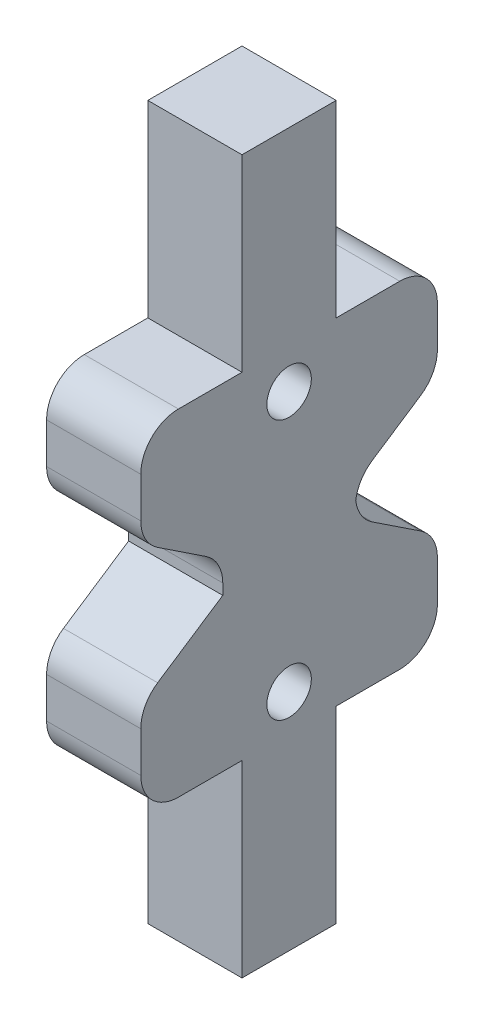
ISO-10303-21;
HEADER;
FILE_DESCRIPTION(('STEP AP214'),'2;1');
FILE_NAME('part.step','',(''),(''),'','','');
FILE_SCHEMA(('AUTOMOTIVE_DESIGN { 1 0 10303 214 1 1 1 1 }'));
ENDSEC;
DATA;
#1=APPLICATION_CONTEXT('core data for automotive mechanical design processes');
#2=APPLICATION_PROTOCOL_DEFINITION('international standard','automotive_design',2000,#1);
#3=PRODUCT_CONTEXT('',#1,'mechanical');
#4=PRODUCT('Part','Part','',(#3));
#5=PRODUCT_RELATED_PRODUCT_CATEGORY('part','',(#4));
#6=PRODUCT_DEFINITION_FORMATION('','',#4);
#7=PRODUCT_DEFINITION_CONTEXT('part definition',#1,'design');
#8=PRODUCT_DEFINITION('design','',#6,#7);
#9=PRODUCT_DEFINITION_SHAPE('','',#8);
#10=(LENGTH_UNIT() NAMED_UNIT(*) SI_UNIT(.MILLI.,.METRE.));
#11=(NAMED_UNIT(*) PLANE_ANGLE_UNIT() SI_UNIT($,.RADIAN.));
#12=(NAMED_UNIT(*) SI_UNIT($,.STERADIAN.) SOLID_ANGLE_UNIT());
#13=UNCERTAINTY_MEASURE_WITH_UNIT(LENGTH_MEASURE(1.E-05),#10,'distance_accuracy_value','');
#14=(GEOMETRIC_REPRESENTATION_CONTEXT(3) GLOBAL_UNCERTAINTY_ASSIGNED_CONTEXT((#13)) GLOBAL_UNIT_ASSIGNED_CONTEXT((#10,
#11,#12)) REPRESENTATION_CONTEXT('',''));
#15=CARTESIAN_POINT('',(0.,0.,0.));
#16=DIRECTION('',(0.,0.,1.));
#17=DIRECTION('',(1.,0.,0.));
#18=AXIS2_PLACEMENT_3D('',#15,#16,#17);
#19=CARTESIAN_POINT('',(6.35,0.,0.));
#20=DIRECTION('',(-1.,0.,0.));
#21=DIRECTION('',(0.,0.,1.));
#22=AXIS2_PLACEMENT_3D('',#19,#20,#21);
#23=PLANE('',#22);
#24=DIRECTION('',(0.,1.,0.));
#25=VECTOR('',#24,1.);
#26=CARTESIAN_POINT('',(6.35,16.0364207864945,-20.));
#27=LINE('',#26,#25);
#28=CARTESIAN_POINT('',(6.35,17.4012975552307,-20.));
#29=VERTEX_POINT('',#28);
#30=CARTESIAN_POINT('',(6.35,20.1259948,-20.));
#31=VERTEX_POINT('',#30);
#32=EDGE_CURVE('E291',#29,#31,#27,.T.);
#33=ORIENTED_EDGE('',*,*,#32,.T.);
#34=CARTESIAN_POINT('',(6.35,20.1259948,-17.46));
#35=DIRECTION('',(-1.,0.,0.));
#36=DIRECTION('',(0.,0.,1.));
#37=AXIS2_PLACEMENT_3D('',#34,#35,#36);
#38=CIRCLE('',#37,2.54);
#39=CARTESIAN_POINT('',(6.35,22.6659948,-17.46));
#40=VERTEX_POINT('',#39);
#41=EDGE_CURVE('E476',#31,#40,#38,.F.);
#42=ORIENTED_EDGE('',*,*,#41,.T.);
#43=DIRECTION('',(0.,0.,1.));
#44=VECTOR('',#43,1.);
#45=CARTESIAN_POINT('',(6.35,22.6659948,-13.175));
#46=LINE('',#45,#44);
#47=CARTESIAN_POINT('',(6.35,22.6659948,-13.175));
#48=VERTEX_POINT('',#47);
#49=EDGE_CURVE('E294',#40,#48,#46,.T.);
#50=ORIENTED_EDGE('',*,*,#49,.T.);
#51=DIRECTION('',(0.,1.,0.));
#52=VECTOR('',#51,1.);
#53=CARTESIAN_POINT('',(6.35,35.3659948,-13.175));
#54=LINE('',#53,#52);
#55=CARTESIAN_POINT('',(6.35,35.3659948,-13.175));
#56=VERTEX_POINT('',#55);
#57=EDGE_CURVE('E297',#48,#56,#54,.T.);
#58=ORIENTED_EDGE('',*,*,#57,.T.);
#59=DIRECTION('',(0.,0.,1.));
#60=VECTOR('',#59,1.);
#61=CARTESIAN_POINT('',(6.35,35.3659948,-6.825));
#62=LINE('',#61,#60);
#63=CARTESIAN_POINT('',(6.35,35.3659948,-6.825));
#64=VERTEX_POINT('',#63);
#65=EDGE_CURVE('E300',#56,#64,#62,.T.);
#66=ORIENTED_EDGE('',*,*,#65,.T.);
#67=DIRECTION('',(0.,-1.,0.));
#68=VECTOR('',#67,1.);
#69=CARTESIAN_POINT('',(6.35,35.3659948,-6.825));
#70=LINE('',#69,#68);
#71=CARTESIAN_POINT('',(6.35,22.6659948,-6.825));
#72=VERTEX_POINT('',#71);
#73=EDGE_CURVE('E303',#64,#72,#70,.T.);
#74=ORIENTED_EDGE('',*,*,#73,.T.);
#75=DIRECTION('',(0.,0.,1.));
#76=VECTOR('',#75,1.);
#77=CARTESIAN_POINT('',(6.35,22.6659948,0.));
#78=LINE('',#77,#76);
#79=CARTESIAN_POINT('',(6.35,22.6659948,-2.54));
#80=VERTEX_POINT('',#79);
#81=EDGE_CURVE('E306',#72,#80,#78,.T.);
#82=ORIENTED_EDGE('',*,*,#81,.T.);
#83=CARTESIAN_POINT('',(6.35,20.1259948,-2.54));
#84=DIRECTION('',(-1.,0.,0.));
#85=DIRECTION('',(0.,0.,1.));
#86=AXIS2_PLACEMENT_3D('',#83,#84,#85);
#87=CIRCLE('',#86,2.54);
#88=CARTESIAN_POINT('',(6.35,20.1259948,0.));
#89=VERTEX_POINT('',#88);
#90=EDGE_CURVE('E456',#80,#89,#87,.F.);
#91=ORIENTED_EDGE('',*,*,#90,.T.);
#92=DIRECTION('',(0.,-1.,0.));
#93=VECTOR('',#92,1.);
#94=CARTESIAN_POINT('',(6.35,16.0364207864945,0.));
#95=LINE('',#94,#93);
#96=CARTESIAN_POINT('',(6.35,17.4012975552307,0.));
#97=VERTEX_POINT('',#96);
#98=EDGE_CURVE('E310',#89,#97,#95,.T.);
#99=ORIENTED_EDGE('',*,*,#98,.T.);
#100=CARTESIAN_POINT('',(6.35,17.4012975552307,-2.54));
#101=DIRECTION('',(-1.,0.,0.));
#102=DIRECTION('',(0.,0.,1.));
#103=AXIS2_PLACEMENT_3D('',#100,#101,#102);
#104=CIRCLE('',#103,2.54);
#105=CARTESIAN_POINT('',(6.35,15.2831543016079,-1.13819075579723));
#106=VERTEX_POINT('',#105);
#107=EDGE_CURVE('E459',#97,#106,#104,.F.);
#108=ORIENTED_EDGE('',*,*,#107,.T.);
#109=DIRECTION('',(0.,-0.551893403229435,-0.83391466678062));
#110=VECTOR('',#109,1.);
#111=CARTESIAN_POINT('',(6.35,16.0364207864945,0.));
#112=LINE('',#111,#110);
#113=CARTESIAN_POINT('',(6.35,13.1308691071061,-4.39030824857267));
#114=VERTEX_POINT('',#113);
#115=EDGE_CURVE('E314',#106,#114,#112,.T.);
#116=ORIENTED_EDGE('',*,*,#115,.T.);
#117=CARTESIAN_POINT('',(6.35,11.0127258534833,-2.98849900436991));
#118=DIRECTION('',(-1.,0.,0.));
#119=DIRECTION('',(0.,0.,1.));
#120=AXIS2_PLACEMENT_3D('',#117,#118,#119);
#121=CIRCLE('',#120,2.54);
#122=CARTESIAN_POINT('',(6.35,11.0127258534833,-5.52849900436991));
#123=VERTEX_POINT('',#122);
#124=EDGE_CURVE('E11',#114,#123,#121,.T.);
#125=ORIENTED_EDGE('',*,*,#124,.T.);
#126=DIRECTION('',(0.,-1.,0.));
#127=VECTOR('',#126,1.);
#128=CARTESIAN_POINT('',(6.35,12.3776026222195,-5.5284990043699));
#129=LINE('',#128,#127);
#130=CARTESIAN_POINT('',(6.35,10.2883921777805,-5.52849900436991));
#131=VERTEX_POINT('',#130);
#132=EDGE_CURVE('E318',#123,#131,#129,.T.);
#133=ORIENTED_EDGE('',*,*,#132,.T.);
#134=DIRECTION('',(0.,-0.551893403229435,0.83391466678062));
#135=VECTOR('',#134,1.);
#136=CARTESIAN_POINT('',(6.35,10.2883921777805,-5.52849900436991));
#137=LINE('',#136,#135);
#138=CARTESIAN_POINT('',(6.35,7.38284049839211,-1.13819075579724));
#139=VERTEX_POINT('',#138);
#140=EDGE_CURVE('E321',#131,#139,#137,.T.);
#141=ORIENTED_EDGE('',*,*,#140,.T.);
#142=CARTESIAN_POINT('',(6.35,5.26469724476934,-2.54));
#143=DIRECTION('',(-1.,0.,0.));
#144=DIRECTION('',(0.,0.,1.));
#145=AXIS2_PLACEMENT_3D('',#142,#143,#144);
#146=CIRCLE('',#145,2.54);
#147=CARTESIAN_POINT('',(6.35,5.26469724476934,0.));
#148=VERTEX_POINT('',#147);
#149=EDGE_CURVE('E462',#139,#148,#146,.F.);
#150=ORIENTED_EDGE('',*,*,#149,.T.);
#151=DIRECTION('',(0.,-1.,0.));
#152=VECTOR('',#151,1.);
#153=CARTESIAN_POINT('',(6.35,0.,0.));
#154=LINE('',#153,#152);
#155=CARTESIAN_POINT('',(6.35,2.54,0.));
#156=VERTEX_POINT('',#155);
#157=EDGE_CURVE('E250',#148,#156,#154,.T.);
#158=ORIENTED_EDGE('',*,*,#157,.T.);
#159=CARTESIAN_POINT('',(6.35,2.54,-2.54));
#160=DIRECTION('',(-1.,0.,0.));
#161=DIRECTION('',(0.,0.,1.));
#162=AXIS2_PLACEMENT_3D('',#159,#160,#161);
#163=CIRCLE('',#162,2.54);
#164=CARTESIAN_POINT('',(6.35,0.,-2.54));
#165=VERTEX_POINT('',#164);
#166=EDGE_CURVE('E245',#156,#165,#163,.F.);
#167=ORIENTED_EDGE('',*,*,#166,.T.);
#168=DIRECTION('',(0.,0.,-1.));
#169=VECTOR('',#168,1.);
#170=CARTESIAN_POINT('',(6.35,0.,0.));
#171=LINE('',#170,#169);
#172=CARTESIAN_POINT('',(6.35,0.,-6.825));
#173=VERTEX_POINT('',#172);
#174=EDGE_CURVE('E236',#165,#173,#171,.T.);
#175=ORIENTED_EDGE('',*,*,#174,.T.);
#176=DIRECTION('',(0.,-1.,0.));
#177=VECTOR('',#176,1.);
#178=CARTESIAN_POINT('',(6.35,-12.7,-6.825));
#179=LINE('',#178,#177);
#180=CARTESIAN_POINT('',(6.35,-12.7,-6.825));
#181=VERTEX_POINT('',#180);
#182=EDGE_CURVE('E241',#173,#181,#179,.T.);
#183=ORIENTED_EDGE('',*,*,#182,.T.);
#184=DIRECTION('',(0.,0.,-1.));
#185=VECTOR('',#184,1.);
#186=CARTESIAN_POINT('',(6.35,-12.7,-6.825));
#187=LINE('',#186,#185);
#188=CARTESIAN_POINT('',(6.35,-12.7,-13.175));
#189=VERTEX_POINT('',#188);
#190=EDGE_CURVE('E267',#181,#189,#187,.T.);
#191=ORIENTED_EDGE('',*,*,#190,.T.);
#192=DIRECTION('',(0.,1.,0.));
#193=VECTOR('',#192,1.);
#194=CARTESIAN_POINT('',(6.35,-12.7,-13.175));
#195=LINE('',#194,#193);
#196=CARTESIAN_POINT('',(6.35,0.,-13.175));
#197=VERTEX_POINT('',#196);
#198=EDGE_CURVE('E270',#189,#197,#195,.T.);
#199=ORIENTED_EDGE('',*,*,#198,.T.);
#200=DIRECTION('',(0.,0.,-1.));
#201=VECTOR('',#200,1.);
#202=CARTESIAN_POINT('',(6.35,0.,-13.175));
#203=LINE('',#202,#201);
#204=CARTESIAN_POINT('',(6.35,0.,-17.46));
#205=VERTEX_POINT('',#204);
#206=EDGE_CURVE('E276',#197,#205,#203,.T.);
#207=ORIENTED_EDGE('',*,*,#206,.T.);
#208=CARTESIAN_POINT('',(6.35,2.54,-17.46));
#209=DIRECTION('',(-1.,0.,0.));
#210=DIRECTION('',(0.,0.,1.));
#211=AXIS2_PLACEMENT_3D('',#208,#209,#210);
#212=CIRCLE('',#211,2.54);
#213=CARTESIAN_POINT('',(6.35,2.54,-20.));
#214=VERTEX_POINT('',#213);
#215=EDGE_CURVE('E467',#205,#214,#212,.F.);
#216=ORIENTED_EDGE('',*,*,#215,.T.);
#217=DIRECTION('',(0.,1.,0.));
#218=VECTOR('',#217,1.);
#219=CARTESIAN_POINT('',(6.35,0.,-20.));
#220=LINE('',#219,#218);
#221=CARTESIAN_POINT('',(6.35,5.26469724476934,-20.));
#222=VERTEX_POINT('',#221);
#223=EDGE_CURVE('E280',#214,#222,#220,.T.);
#224=ORIENTED_EDGE('',*,*,#223,.T.);
#225=CARTESIAN_POINT('',(6.35,5.26469724476934,-17.46));
#226=DIRECTION('',(-1.,0.,0.));
#227=DIRECTION('',(0.,0.,1.));
#228=AXIS2_PLACEMENT_3D('',#225,#226,#227);
#229=CIRCLE('',#228,2.54);
#230=CARTESIAN_POINT('',(6.35,7.38284049839212,-18.8618092442028));
#231=VERTEX_POINT('',#230);
#232=EDGE_CURVE('E470',#222,#231,#229,.F.);
#233=ORIENTED_EDGE('',*,*,#232,.T.);
#234=DIRECTION('',(0.,0.551893403229435,0.83391466678062));
#235=VECTOR('',#234,1.);
#236=CARTESIAN_POINT('',(6.35,10.2883921777805,-14.4715009956301));
#237=LINE('',#236,#235);
#238=CARTESIAN_POINT('',(6.35,9.53512569289389,-15.6096917514273));
#239=VERTEX_POINT('',#238);
#240=EDGE_CURVE('E284',#231,#239,#237,.T.);
#241=ORIENTED_EDGE('',*,*,#240,.T.);
#242=CARTESIAN_POINT('',(6.35,11.6532689465167,-17.0115009956301));
#243=DIRECTION('',(-1.,0.,0.));
#244=DIRECTION('',(0.,0.,1.));
#245=AXIS2_PLACEMENT_3D('',#242,#243,#244);
#246=CIRCLE('',#245,2.54);
#247=CARTESIAN_POINT('',(6.35,11.3329974,-14.4917736023409));
#248=VERTEX_POINT('',#247);
#249=EDGE_CURVE('E56',#239,#248,#246,.T.);
#250=ORIENTED_EDGE('',*,*,#249,.T.);
#251=CARTESIAN_POINT('',(6.35,11.0127258534833,-17.0115009956301));
#252=DIRECTION('',(-1.,0.,0.));
#253=DIRECTION('',(0.,0.,1.));
#254=AXIS2_PLACEMENT_3D('',#251,#252,#253);
#255=CIRCLE('',#254,2.54);
#256=CARTESIAN_POINT('',(6.35,13.1308691071061,-15.6096917514273));
#257=VERTEX_POINT('',#256);
#258=EDGE_CURVE('E539',#248,#257,#255,.T.);
#259=ORIENTED_EDGE('',*,*,#258,.T.);
#260=DIRECTION('',(0.,0.551893403229435,-0.83391466678062));
#261=VECTOR('',#260,1.);
#262=CARTESIAN_POINT('',(6.35,16.0364207864945,-20.));
#263=LINE('',#262,#261);
#264=CARTESIAN_POINT('',(6.35,15.2831543016079,-18.8618092442028));
#265=VERTEX_POINT('',#264);
#266=EDGE_CURVE('E287',#257,#265,#263,.T.);
#267=ORIENTED_EDGE('',*,*,#266,.T.);
#268=CARTESIAN_POINT('',(6.35,17.4012975552307,-17.46));
#269=DIRECTION('',(-1.,0.,0.));
#270=DIRECTION('',(0.,0.,1.));
#271=AXIS2_PLACEMENT_3D('',#268,#269,#270);
#272=CIRCLE('',#271,2.54);
#273=EDGE_CURVE('E473',#265,#29,#272,.F.);
#274=ORIENTED_EDGE('',*,*,#273,.T.);
#275=EDGE_LOOP('',(#33,#42,#50,#58,#66,#74,#82,#91,#99,#108,#116,#125,#133,#141,#150,#158,#167,
#175,#183,#191,#199,#207,#216,#224,#233,#241,#250,#259,#267,#274));
#276=FACE_BOUND('',#275,.T.);
#277=CARTESIAN_POINT('',(6.35,19.9520048,-10.));
#278=DIRECTION('',(1.,0.,0.));
#279=DIRECTION('',(0.,0.,-1.));
#280=AXIS2_PLACEMENT_3D('',#277,#278,#279);
#281=CIRCLE('',#280,1.49987);
#282=CARTESIAN_POINT('',(6.35,19.9520048,-11.49987));
#283=VERTEX_POINT('',#282);
#284=EDGE_CURVE('E330',#283,#283,#281,.T.);
#285=ORIENTED_EDGE('',*,*,#284,.F.);
#286=EDGE_LOOP('',(#285));
#287=FACE_BOUND('',#286,.T.);
#288=CARTESIAN_POINT('',(6.35,2.4260048,-10.));
#289=DIRECTION('',(1.,0.,0.));
#290=DIRECTION('',(0.,0.,-1.));
#291=AXIS2_PLACEMENT_3D('',#288,#289,#290);
#292=CIRCLE('',#291,1.49987);
#293=CARTESIAN_POINT('',(6.35,2.4260048,-11.49987));
#294=VERTEX_POINT('',#293);
#295=EDGE_CURVE('E588',#294,#294,#292,.T.);
#296=ORIENTED_EDGE('',*,*,#295,.F.);
#297=EDGE_LOOP('',(#296));
#298=FACE_BOUND('',#297,.T.);
#299=ADVANCED_FACE('F39',(#276,#287,#298),#23,.F.);
#300=CARTESIAN_POINT('',(0.,0.,0.));
#301=DIRECTION('',(-1.,0.,0.));
#302=DIRECTION('',(0.,0.,1.));
#303=AXIS2_PLACEMENT_3D('',#300,#301,#302);
#304=PLANE('',#303);
#305=CARTESIAN_POINT('',(0.,19.9520048,-10.));
#306=DIRECTION('',(1.,0.,0.));
#307=DIRECTION('',(0.,0.,-1.));
#308=AXIS2_PLACEMENT_3D('',#305,#306,#307);
#309=CIRCLE('',#308,1.49987);
#310=CARTESIAN_POINT('',(0.,19.9520048,-11.49987));
#311=VERTEX_POINT('',#310);
#312=EDGE_CURVE('E584',#311,#311,#309,.T.);
#313=ORIENTED_EDGE('',*,*,#312,.T.);
#314=EDGE_LOOP('',(#313));
#315=FACE_BOUND('',#314,.T.);
#316=DIRECTION('',(0.,0.,1.));
#317=VECTOR('',#316,1.);
#318=CARTESIAN_POINT('',(0.,22.6659948,-13.175));
#319=LINE('',#318,#317);
#320=CARTESIAN_POINT('',(0.,22.6659948,-17.46));
#321=VERTEX_POINT('',#320);
#322=CARTESIAN_POINT('',(0.,22.6659948,-13.175));
#323=VERTEX_POINT('',#322);
#324=EDGE_CURVE('E362',#321,#323,#319,.T.);
#325=ORIENTED_EDGE('',*,*,#324,.F.);
#326=CARTESIAN_POINT('',(0.,20.1259948,-17.46));
#327=DIRECTION('',(-1.,0.,0.));
#328=DIRECTION('',(0.,0.,1.));
#329=AXIS2_PLACEMENT_3D('',#326,#327,#328);
#330=CIRCLE('',#329,2.54);
#331=CARTESIAN_POINT('',(0.,20.1259948,-20.));
#332=VERTEX_POINT('',#331);
#333=EDGE_CURVE('E446',#321,#332,#330,.T.);
#334=ORIENTED_EDGE('',*,*,#333,.T.);
#335=DIRECTION('',(0.,1.,0.));
#336=VECTOR('',#335,1.);
#337=CARTESIAN_POINT('',(0.,16.0364207864945,-20.));
#338=LINE('',#337,#336);
#339=CARTESIAN_POINT('',(0.,17.4012975552307,-20.));
#340=VERTEX_POINT('',#339);
#341=EDGE_CURVE('E358',#340,#332,#338,.T.);
#342=ORIENTED_EDGE('',*,*,#341,.F.);
#343=CARTESIAN_POINT('',(0.,17.4012975552307,-17.46));
#344=DIRECTION('',(-1.,0.,0.));
#345=DIRECTION('',(0.,0.,1.));
#346=AXIS2_PLACEMENT_3D('',#343,#344,#345);
#347=CIRCLE('',#346,2.54);
#348=CARTESIAN_POINT('',(0.,15.2831543016079,-18.8618092442028));
#349=VERTEX_POINT('',#348);
#350=EDGE_CURVE('E443',#340,#349,#347,.T.);
#351=ORIENTED_EDGE('',*,*,#350,.T.);
#352=DIRECTION('',(0.,0.551893403229435,-0.83391466678062));
#353=VECTOR('',#352,1.);
#354=CARTESIAN_POINT('',(0.,16.0364207864945,-20.));
#355=LINE('',#354,#353);
#356=CARTESIAN_POINT('',(0.,13.1308691071061,-15.6096917514273));
#357=VERTEX_POINT('',#356);
#358=EDGE_CURVE('E354',#357,#349,#355,.T.);
#359=ORIENTED_EDGE('',*,*,#358,.F.);
#360=CARTESIAN_POINT('',(0.,11.0127258534833,-17.0115009956301));
#361=DIRECTION('',(-1.,0.,0.));
#362=DIRECTION('',(0.,0.,1.));
#363=AXIS2_PLACEMENT_3D('',#360,#361,#362);
#364=CIRCLE('',#363,2.54);
#365=CARTESIAN_POINT('',(0.,11.3329974,-14.4917736023409));
#366=VERTEX_POINT('',#365);
#367=EDGE_CURVE('E64',#357,#366,#364,.F.);
#368=ORIENTED_EDGE('',*,*,#367,.T.);
#369=CARTESIAN_POINT('',(0.,11.6532689465167,-17.0115009956301));
#370=DIRECTION('',(-1.,0.,0.));
#371=DIRECTION('',(0.,0.,1.));
#372=AXIS2_PLACEMENT_3D('',#369,#370,#371);
#373=CIRCLE('',#372,2.54);
#374=CARTESIAN_POINT('',(0.,9.53512569289389,-15.6096917514273));
#375=VERTEX_POINT('',#374);
#376=EDGE_CURVE('E542',#366,#375,#373,.F.);
#377=ORIENTED_EDGE('',*,*,#376,.T.);
#378=DIRECTION('',(0.,0.551893403229435,0.83391466678062));
#379=VECTOR('',#378,1.);
#380=CARTESIAN_POINT('',(0.,10.2883921777805,-14.4715009956301));
#381=LINE('',#380,#379);
#382=CARTESIAN_POINT('',(0.,7.38284049839212,-18.8618092442028));
#383=VERTEX_POINT('',#382);
#384=EDGE_CURVE('E350',#383,#375,#381,.T.);
#385=ORIENTED_EDGE('',*,*,#384,.F.);
#386=CARTESIAN_POINT('',(0.,5.26469724476934,-17.46));
#387=DIRECTION('',(-1.,0.,0.));
#388=DIRECTION('',(0.,0.,1.));
#389=AXIS2_PLACEMENT_3D('',#386,#387,#388);
#390=CIRCLE('',#389,2.54);
#391=CARTESIAN_POINT('',(0.,5.26469724476934,-20.));
#392=VERTEX_POINT('',#391);
#393=EDGE_CURVE('E440',#383,#392,#390,.T.);
#394=ORIENTED_EDGE('',*,*,#393,.T.);
#395=DIRECTION('',(0.,1.,0.));
#396=VECTOR('',#395,1.);
#397=CARTESIAN_POINT('',(0.,0.,-20.));
#398=LINE('',#397,#396);
#399=CARTESIAN_POINT('',(0.,2.54,-20.));
#400=VERTEX_POINT('',#399);
#401=EDGE_CURVE('E346',#400,#392,#398,.T.);
#402=ORIENTED_EDGE('',*,*,#401,.F.);
#403=CARTESIAN_POINT('',(0.,2.54,-17.46));
#404=DIRECTION('',(-1.,0.,0.));
#405=DIRECTION('',(0.,0.,1.));
#406=AXIS2_PLACEMENT_3D('',#403,#404,#405);
#407=CIRCLE('',#406,2.54);
#408=CARTESIAN_POINT('',(0.,0.,-17.46));
#409=VERTEX_POINT('',#408);
#410=EDGE_CURVE('E437',#400,#409,#407,.T.);
#411=ORIENTED_EDGE('',*,*,#410,.T.);
#412=DIRECTION('',(0.,0.,-1.));
#413=VECTOR('',#412,1.);
#414=CARTESIAN_POINT('',(0.,0.,-13.175));
#415=LINE('',#414,#413);
#416=CARTESIAN_POINT('',(0.,0.,-13.175));
#417=VERTEX_POINT('',#416);
#418=EDGE_CURVE('E342',#417,#409,#415,.T.);
#419=ORIENTED_EDGE('',*,*,#418,.F.);
#420=DIRECTION('',(0.,1.,0.));
#421=VECTOR('',#420,1.);
#422=CARTESIAN_POINT('',(0.,-12.7,-13.175));
#423=LINE('',#422,#421);
#424=CARTESIAN_POINT('',(0.,-12.7,-13.175));
#425=VERTEX_POINT('',#424);
#426=EDGE_CURVE('E339',#425,#417,#423,.T.);
#427=ORIENTED_EDGE('',*,*,#426,.F.);
#428=DIRECTION('',(0.,0.,-1.));
#429=VECTOR('',#428,1.);
#430=CARTESIAN_POINT('',(0.,-12.7,-6.825));
#431=LINE('',#430,#429);
#432=CARTESIAN_POINT('',(0.,-12.7,-6.825));
#433=VERTEX_POINT('',#432);
#434=EDGE_CURVE('E336',#433,#425,#431,.T.);
#435=ORIENTED_EDGE('',*,*,#434,.F.);
#436=DIRECTION('',(0.,-1.,0.));
#437=VECTOR('',#436,1.);
#438=CARTESIAN_POINT('',(0.,-12.7,-6.825));
#439=LINE('',#438,#437);
#440=CARTESIAN_POINT('',(0.,0.,-6.825));
#441=VERTEX_POINT('',#440);
#442=EDGE_CURVE('E333',#441,#433,#439,.T.);
#443=ORIENTED_EDGE('',*,*,#442,.F.);
#444=DIRECTION('',(0.,0.,-1.));
#445=VECTOR('',#444,1.);
#446=CARTESIAN_POINT('',(0.,0.,0.));
#447=LINE('',#446,#445);
#448=CARTESIAN_POINT('',(0.,0.,-2.54));
#449=VERTEX_POINT('',#448);
#450=EDGE_CURVE('E256',#449,#441,#447,.T.);
#451=ORIENTED_EDGE('',*,*,#450,.F.);
#452=CARTESIAN_POINT('',(0.,2.54,-2.54));
#453=DIRECTION('',(-1.,0.,0.));
#454=DIRECTION('',(0.,0.,1.));
#455=AXIS2_PLACEMENT_3D('',#452,#453,#454);
#456=CIRCLE('',#455,2.54);
#457=CARTESIAN_POINT('',(0.,2.54,0.));
#458=VERTEX_POINT('',#457);
#459=EDGE_CURVE('E434',#449,#458,#456,.T.);
#460=ORIENTED_EDGE('',*,*,#459,.T.);
#461=DIRECTION('',(0.,-1.,0.));
#462=VECTOR('',#461,1.);
#463=CARTESIAN_POINT('',(0.,0.,0.));
#464=LINE('',#463,#462);
#465=CARTESIAN_POINT('',(0.,5.26469724476934,0.));
#466=VERTEX_POINT('',#465);
#467=EDGE_CURVE('E326',#466,#458,#464,.T.);
#468=ORIENTED_EDGE('',*,*,#467,.F.);
#469=CARTESIAN_POINT('',(0.,5.26469724476934,-2.54));
#470=DIRECTION('',(-1.,0.,0.));
#471=DIRECTION('',(0.,0.,1.));
#472=AXIS2_PLACEMENT_3D('',#469,#470,#471);
#473=CIRCLE('',#472,2.54);
#474=CARTESIAN_POINT('',(0.,7.38284049839211,-1.13819075579724));
#475=VERTEX_POINT('',#474);
#476=EDGE_CURVE('E431',#466,#475,#473,.T.);
#477=ORIENTED_EDGE('',*,*,#476,.T.);
#478=DIRECTION('',(0.,-0.551893403229435,0.83391466678062));
#479=VECTOR('',#478,1.);
#480=CARTESIAN_POINT('',(0.,10.2883921777805,-5.52849900436991));
#481=LINE('',#480,#479);
#482=CARTESIAN_POINT('',(0.,10.2883921777805,-5.52849900436991));
#483=VERTEX_POINT('',#482);
#484=EDGE_CURVE('E389',#483,#475,#481,.T.);
#485=ORIENTED_EDGE('',*,*,#484,.F.);
#486=DIRECTION('',(0.,-1.,0.));
#487=VECTOR('',#486,1.);
#488=CARTESIAN_POINT('',(0.,12.3776026222195,-5.5284990043699));
#489=LINE('',#488,#487);
#490=CARTESIAN_POINT('',(0.,11.0127258534833,-5.52849900436991));
#491=VERTEX_POINT('',#490);
#492=EDGE_CURVE('E386',#491,#483,#489,.T.);
#493=ORIENTED_EDGE('',*,*,#492,.F.);
#494=CARTESIAN_POINT('',(0.,11.0127258534833,-2.98849900436991));
#495=DIRECTION('',(-1.,0.,0.));
#496=DIRECTION('',(0.,0.,1.));
#497=AXIS2_PLACEMENT_3D('',#494,#495,#496);
#498=CIRCLE('',#497,2.54);
#499=CARTESIAN_POINT('',(0.,13.1308691071061,-4.39030824857267));
#500=VERTEX_POINT('',#499);
#501=EDGE_CURVE('E49',#491,#500,#498,.F.);
#502=ORIENTED_EDGE('',*,*,#501,.T.);
#503=DIRECTION('',(0.,-0.551893403229435,-0.83391466678062));
#504=VECTOR('',#503,1.);
#505=CARTESIAN_POINT('',(0.,16.0364207864945,0.));
#506=LINE('',#505,#504);
#507=CARTESIAN_POINT('',(0.,15.2831543016079,-1.13819075579723));
#508=VERTEX_POINT('',#507);
#509=EDGE_CURVE('E382',#508,#500,#506,.T.);
#510=ORIENTED_EDGE('',*,*,#509,.F.);
#511=CARTESIAN_POINT('',(0.,17.4012975552307,-2.54));
#512=DIRECTION('',(-1.,0.,0.));
#513=DIRECTION('',(0.,0.,1.));
#514=AXIS2_PLACEMENT_3D('',#511,#512,#513);
#515=CIRCLE('',#514,2.54);
#516=CARTESIAN_POINT('',(0.,17.4012975552307,0.));
#517=VERTEX_POINT('',#516);
#518=EDGE_CURVE('E428',#508,#517,#515,.T.);
#519=ORIENTED_EDGE('',*,*,#518,.T.);
#520=DIRECTION('',(0.,-1.,0.));
#521=VECTOR('',#520,1.);
#522=CARTESIAN_POINT('',(0.,16.0364207864945,0.));
#523=LINE('',#522,#521);
#524=CARTESIAN_POINT('',(0.,20.1259948,0.));
#525=VERTEX_POINT('',#524);
#526=EDGE_CURVE('E378',#525,#517,#523,.T.);
#527=ORIENTED_EDGE('',*,*,#526,.F.);
#528=CARTESIAN_POINT('',(0.,20.1259948,-2.54));
#529=DIRECTION('',(-1.,0.,0.));
#530=DIRECTION('',(0.,0.,1.));
#531=AXIS2_PLACEMENT_3D('',#528,#529,#530);
#532=CIRCLE('',#531,2.54);
#533=CARTESIAN_POINT('',(0.,22.6659948,-2.54));
#534=VERTEX_POINT('',#533);
#535=EDGE_CURVE('E425',#525,#534,#532,.T.);
#536=ORIENTED_EDGE('',*,*,#535,.T.);
#537=DIRECTION('',(0.,0.,1.));
#538=VECTOR('',#537,1.);
#539=CARTESIAN_POINT('',(0.,22.6659948,0.));
#540=LINE('',#539,#538);
#541=CARTESIAN_POINT('',(0.,22.6659948,-6.825));
#542=VERTEX_POINT('',#541);
#543=EDGE_CURVE('E374',#542,#534,#540,.T.);
#544=ORIENTED_EDGE('',*,*,#543,.F.);
#545=DIRECTION('',(0.,-1.,0.));
#546=VECTOR('',#545,1.);
#547=CARTESIAN_POINT('',(0.,35.3659948,-6.825));
#548=LINE('',#547,#546);
#549=CARTESIAN_POINT('',(0.,35.3659948,-6.825));
#550=VERTEX_POINT('',#549);
#551=EDGE_CURVE('E371',#550,#542,#548,.T.);
#552=ORIENTED_EDGE('',*,*,#551,.F.);
#553=DIRECTION('',(0.,0.,1.));
#554=VECTOR('',#553,1.);
#555=CARTESIAN_POINT('',(0.,35.3659948,-6.825));
#556=LINE('',#555,#554);
#557=CARTESIAN_POINT('',(0.,35.3659948,-13.175));
#558=VERTEX_POINT('',#557);
#559=EDGE_CURVE('E368',#558,#550,#556,.T.);
#560=ORIENTED_EDGE('',*,*,#559,.F.);
#561=DIRECTION('',(0.,1.,0.));
#562=VECTOR('',#561,1.);
#563=CARTESIAN_POINT('',(0.,35.3659948,-13.175));
#564=LINE('',#563,#562);
#565=EDGE_CURVE('E365',#323,#558,#564,.T.);
#566=ORIENTED_EDGE('',*,*,#565,.F.);
#567=EDGE_LOOP('',(#325,#334,#342,#351,#359,#368,#377,#385,#394,#402,#411,#419,#427,#435,#443,
#451,#460,#468,#477,#485,#493,#502,#510,#519,#527,#536,#544,#552,#560,#566));
#568=FACE_BOUND('',#567,.T.);
#569=CARTESIAN_POINT('',(0.,2.4260048,-10.));
#570=DIRECTION('',(1.,0.,0.));
#571=DIRECTION('',(0.,0.,-1.));
#572=AXIS2_PLACEMENT_3D('',#569,#570,#571);
#573=CIRCLE('',#572,1.49987);
#574=CARTESIAN_POINT('',(0.,2.4260048,-11.49987));
#575=VERTEX_POINT('',#574);
#576=EDGE_CURVE('E592',#575,#575,#573,.T.);
#577=ORIENTED_EDGE('',*,*,#576,.T.);
#578=EDGE_LOOP('',(#577));
#579=FACE_BOUND('',#578,.T.);
#580=ADVANCED_FACE('F551',(#315,#568,#579),#304,.T.);
#581=CARTESIAN_POINT('',(6.35,0.,0.));
#582=DIRECTION('',(0.,0.,-1.));
#583=DIRECTION('',(-1.,0.,0.));
#584=AXIS2_PLACEMENT_3D('',#581,#582,#583);
#585=PLANE('',#584);
#586=ORIENTED_EDGE('',*,*,#467,.T.);
#587=DIRECTION('',(-1.,0.,0.));
#588=VECTOR('',#587,1.);
#589=CARTESIAN_POINT('',(6.35,2.54,0.));
#590=LINE('',#589,#588);
#591=EDGE_CURVE('E510',#458,#156,#590,.F.);
#592=ORIENTED_EDGE('',*,*,#591,.T.);
#593=ORIENTED_EDGE('',*,*,#157,.F.);
#594=DIRECTION('',(-1.,0.,0.));
#595=VECTOR('',#594,1.);
#596=CARTESIAN_POINT('',(6.35,5.26469724476934,0.));
#597=LINE('',#596,#595);
#598=EDGE_CURVE('E506',#148,#466,#597,.T.);
#599=ORIENTED_EDGE('',*,*,#598,.T.);
#600=EDGE_LOOP('',(#586,#592,#593,#599));
#601=FACE_BOUND('',#600,.T.);
#602=ADVANCED_FACE('F578',(#601),#585,.F.);
#603=CARTESIAN_POINT('',(6.35,0.,0.));
#604=DIRECTION('',(0.,1.,0.));
#605=DIRECTION('',(0.,0.,1.));
#606=AXIS2_PLACEMENT_3D('',#603,#604,#605);
#607=PLANE('',#606);
#608=ORIENTED_EDGE('',*,*,#174,.F.);
#609=DIRECTION('',(-1.,0.,0.));
#610=VECTOR('',#609,1.);
#611=CARTESIAN_POINT('',(6.35,0.,-2.54));
#612=LINE('',#611,#610);
#613=EDGE_CURVE('E503',#165,#449,#612,.T.);
#614=ORIENTED_EDGE('',*,*,#613,.T.);
#615=ORIENTED_EDGE('',*,*,#450,.T.);
#616=DIRECTION('',(-1.,0.,0.));
#617=VECTOR('',#616,1.);
#618=CARTESIAN_POINT('',(6.35,0.,-6.825));
#619=LINE('',#618,#617);
#620=EDGE_CURVE('E253',#173,#441,#619,.T.);
#621=ORIENTED_EDGE('',*,*,#620,.F.);
#622=EDGE_LOOP('',(#608,#614,#615,#621));
#623=FACE_BOUND('',#622,.T.);
#624=ADVANCED_FACE('F254',(#623),#607,.F.);
#625=CARTESIAN_POINT('',(6.35,-12.7,-6.825));
#626=DIRECTION('',(0.,0.,-1.));
#627=DIRECTION('',(-1.,0.,0.));
#628=AXIS2_PLACEMENT_3D('',#625,#626,#627);
#629=PLANE('',#628);
#630=ORIENTED_EDGE('',*,*,#442,.T.);
#631=DIRECTION('',(-1.,0.,0.));
#632=VECTOR('',#631,1.);
#633=CARTESIAN_POINT('',(6.35,-12.7,-6.825));
#634=LINE('',#633,#632);
#635=EDGE_CURVE('E261',#181,#433,#634,.T.);
#636=ORIENTED_EDGE('',*,*,#635,.F.);
#637=ORIENTED_EDGE('',*,*,#182,.F.);
#638=ORIENTED_EDGE('',*,*,#620,.T.);
#639=EDGE_LOOP('',(#630,#636,#637,#638));
#640=FACE_BOUND('',#639,.T.);
#641=ADVANCED_FACE('F263',(#640),#629,.F.);
#642=CARTESIAN_POINT('',(6.35,-12.7,-6.825));
#643=DIRECTION('',(0.,1.,0.));
#644=DIRECTION('',(0.,0.,1.));
#645=AXIS2_PLACEMENT_3D('',#642,#643,#644);
#646=PLANE('',#645);
#647=ORIENTED_EDGE('',*,*,#434,.T.);
#648=DIRECTION('',(-1.,0.,0.));
#649=VECTOR('',#648,1.);
#650=CARTESIAN_POINT('',(6.35,-12.7,-13.175));
#651=LINE('',#650,#649);
#652=EDGE_CURVE('E416',#189,#425,#651,.T.);
#653=ORIENTED_EDGE('',*,*,#652,.F.);
#654=ORIENTED_EDGE('',*,*,#190,.F.);
#655=ORIENTED_EDGE('',*,*,#635,.T.);
#656=EDGE_LOOP('',(#647,#653,#654,#655));
#657=FACE_BOUND('',#656,.T.);
#658=ADVANCED_FACE('F667',(#657),#646,.F.);
#659=CARTESIAN_POINT('',(6.35,-12.7,-13.175));
#660=DIRECTION('',(0.,0.,1.));
#661=DIRECTION('',(1.,0.,0.));
#662=AXIS2_PLACEMENT_3D('',#659,#660,#661);
#663=PLANE('',#662);
#664=ORIENTED_EDGE('',*,*,#426,.T.);
#665=DIRECTION('',(-1.,0.,0.));
#666=VECTOR('',#665,1.);
#667=CARTESIAN_POINT('',(6.35,0.,-13.175));
#668=LINE('',#667,#666);
#669=EDGE_CURVE('E412',#197,#417,#668,.T.);
#670=ORIENTED_EDGE('',*,*,#669,.F.);
#671=ORIENTED_EDGE('',*,*,#198,.F.);
#672=ORIENTED_EDGE('',*,*,#652,.T.);
#673=EDGE_LOOP('',(#664,#670,#671,#672));
#674=FACE_BOUND('',#673,.T.);
#675=ADVANCED_FACE('F663',(#674),#663,.F.);
#676=CARTESIAN_POINT('',(6.35,0.,-13.175));
#677=DIRECTION('',(0.,1.,0.));
#678=DIRECTION('',(0.,0.,1.));
#679=AXIS2_PLACEMENT_3D('',#676,#677,#678);
#680=PLANE('',#679);
#681=ORIENTED_EDGE('',*,*,#418,.T.);
#682=DIRECTION('',(-1.,0.,0.));
#683=VECTOR('',#682,1.);
#684=CARTESIAN_POINT('',(6.35,0.,-17.46));
#685=LINE('',#684,#683);
#686=EDGE_CURVE('E500',#409,#205,#685,.F.);
#687=ORIENTED_EDGE('',*,*,#686,.T.);
#688=ORIENTED_EDGE('',*,*,#206,.F.);
#689=ORIENTED_EDGE('',*,*,#669,.T.);
#690=EDGE_LOOP('',(#681,#687,#688,#689));
#691=FACE_BOUND('',#690,.T.);
#692=ADVANCED_FACE('F659',(#691),#680,.F.);
#693=CARTESIAN_POINT('',(6.35,0.,-20.));
#694=DIRECTION('',(0.,0.,1.));
#695=DIRECTION('',(0.,-1.,0.));
#696=AXIS2_PLACEMENT_3D('',#693,#694,#695);
#697=PLANE('',#696);
#698=ORIENTED_EDGE('',*,*,#401,.T.);
#699=DIRECTION('',(-1.,0.,0.));
#700=VECTOR('',#699,1.);
#701=CARTESIAN_POINT('',(6.35,5.26469724476934,-20.));
#702=LINE('',#701,#700);
#703=EDGE_CURVE('E497',#392,#222,#702,.F.);
#704=ORIENTED_EDGE('',*,*,#703,.T.);
#705=ORIENTED_EDGE('',*,*,#223,.F.);
#706=DIRECTION('',(-1.,0.,0.));
#707=VECTOR('',#706,1.);
#708=CARTESIAN_POINT('',(6.35,2.54,-20.));
#709=LINE('',#708,#707);
#710=EDGE_CURVE('E493',#214,#400,#709,.T.);
#711=ORIENTED_EDGE('',*,*,#710,.T.);
#712=EDGE_LOOP('',(#698,#704,#705,#711));
#713=FACE_BOUND('',#712,.T.);
#714=ADVANCED_FACE('F655',(#713),#697,.F.);
#715=CARTESIAN_POINT('',(6.35,10.2883921777805,-14.4715009956301));
#716=DIRECTION('',(0.,-0.83391466678062,0.551893403229435));
#717=DIRECTION('',(0.,-0.551893403229435,-0.83391466678062));
#718=AXIS2_PLACEMENT_3D('',#715,#716,#717);
#719=PLANE('',#718);
#720=ORIENTED_EDGE('',*,*,#384,.T.);
#721=DIRECTION('',(-1.,0.,0.));
#722=VECTOR('',#721,1.);
#723=CARTESIAN_POINT('',(6.35,9.53512569289389,-15.6096917514273));
#724=LINE('',#723,#722);
#725=EDGE_CURVE('E490',#375,#239,#724,.F.);
#726=ORIENTED_EDGE('',*,*,#725,.T.);
#727=ORIENTED_EDGE('',*,*,#240,.F.);
#728=DIRECTION('',(-1.,0.,0.));
#729=VECTOR('',#728,1.);
#730=CARTESIAN_POINT('',(6.35,7.38284049839211,-18.8618092442028));
#731=LINE('',#730,#729);
#732=EDGE_CURVE('E486',#231,#383,#731,.T.);
#733=ORIENTED_EDGE('',*,*,#732,.T.);
#734=EDGE_LOOP('',(#720,#726,#727,#733));
#735=FACE_BOUND('',#734,.T.);
#736=ADVANCED_FACE('F651',(#735),#719,.F.);
#737=CARTESIAN_POINT('',(6.35,16.0364207864945,-20.));
#738=DIRECTION('',(0.,0.83391466678062,0.551893403229435));
#739=DIRECTION('',(0.,-0.551893403229435,0.83391466678062));
#740=AXIS2_PLACEMENT_3D('',#737,#738,#739);
#741=PLANE('',#740);
#742=ORIENTED_EDGE('',*,*,#266,.F.);
#743=DIRECTION('',(-1.,0.,0.));
#744=VECTOR('',#743,1.);
#745=CARTESIAN_POINT('',(0.,13.1308691071061,-15.6096917514273));
#746=LINE('',#745,#744);
#747=EDGE_CURVE('E482',#257,#357,#746,.T.);
#748=ORIENTED_EDGE('',*,*,#747,.T.);
#749=ORIENTED_EDGE('',*,*,#358,.T.);
#750=DIRECTION('',(-1.,0.,0.));
#751=VECTOR('',#750,1.);
#752=CARTESIAN_POINT('',(6.35,15.2831543016079,-18.8618092442028));
#753=LINE('',#752,#751);
#754=EDGE_CURVE('E479',#349,#265,#753,.F.);
#755=ORIENTED_EDGE('',*,*,#754,.T.);
#756=EDGE_LOOP('',(#742,#748,#749,#755));
#757=FACE_BOUND('',#756,.T.);
#758=ADVANCED_FACE('F647',(#757),#741,.F.);
#759=CARTESIAN_POINT('',(6.35,16.0364207864945,-20.));
#760=DIRECTION('',(0.,0.,1.));
#761=DIRECTION('',(1.,0.,0.));
#762=AXIS2_PLACEMENT_3D('',#759,#760,#761);
#763=PLANE('',#762);
#764=ORIENTED_EDGE('',*,*,#341,.T.);
#765=DIRECTION('',(-1.,0.,0.));
#766=VECTOR('',#765,1.);
#767=CARTESIAN_POINT('',(6.35,20.1259948,-20.));
#768=LINE('',#767,#766);
#769=EDGE_CURVE('E453',#332,#31,#768,.F.);
#770=ORIENTED_EDGE('',*,*,#769,.T.);
#771=ORIENTED_EDGE('',*,*,#32,.F.);
#772=DIRECTION('',(-1.,0.,0.));
#773=VECTOR('',#772,1.);
#774=CARTESIAN_POINT('',(6.35,17.4012975552307,-20.));
#775=LINE('',#774,#773);
#776=EDGE_CURVE('E449',#29,#340,#775,.T.);
#777=ORIENTED_EDGE('',*,*,#776,.T.);
#778=EDGE_LOOP('',(#764,#770,#771,#777));
#779=FACE_BOUND('',#778,.T.);
#780=ADVANCED_FACE('F643',(#779),#763,.F.);
#781=CARTESIAN_POINT('',(6.35,22.6659948,-13.175));
#782=DIRECTION('',(0.,-1.,0.));
#783=DIRECTION('',(0.,0.,-1.));
#784=AXIS2_PLACEMENT_3D('',#781,#782,#783);
#785=PLANE('',#784);
#786=ORIENTED_EDGE('',*,*,#49,.F.);
#787=DIRECTION('',(-1.,0.,0.));
#788=VECTOR('',#787,1.);
#789=CARTESIAN_POINT('',(6.35,22.6659948,-17.46));
#790=LINE('',#789,#788);
#791=EDGE_CURVE('E260',#40,#321,#790,.T.);
#792=ORIENTED_EDGE('',*,*,#791,.T.);
#793=ORIENTED_EDGE('',*,*,#324,.T.);
#794=DIRECTION('',(-1.,0.,0.));
#795=VECTOR('',#794,1.);
#796=CARTESIAN_POINT('',(6.35,22.6659948,-13.175));
#797=LINE('',#796,#795);
#798=EDGE_CURVE('E408',#48,#323,#797,.T.);
#799=ORIENTED_EDGE('',*,*,#798,.F.);
#800=EDGE_LOOP('',(#786,#792,#793,#799));
#801=FACE_BOUND('',#800,.T.);
#802=ADVANCED_FACE('F639',(#801),#785,.F.);
#803=CARTESIAN_POINT('',(6.35,35.3659948,-13.175));
#804=DIRECTION('',(0.,0.,1.));
#805=DIRECTION('',(1.,0.,0.));
#806=AXIS2_PLACEMENT_3D('',#803,#804,#805);
#807=PLANE('',#806);
#808=ORIENTED_EDGE('',*,*,#565,.T.);
#809=DIRECTION('',(-1.,0.,0.));
#810=VECTOR('',#809,1.);
#811=CARTESIAN_POINT('',(6.35,35.3659948,-13.175));
#812=LINE('',#811,#810);
#813=EDGE_CURVE('E404',#56,#558,#812,.T.);
#814=ORIENTED_EDGE('',*,*,#813,.F.);
#815=ORIENTED_EDGE('',*,*,#57,.F.);
#816=ORIENTED_EDGE('',*,*,#798,.T.);
#817=EDGE_LOOP('',(#808,#814,#815,#816));
#818=FACE_BOUND('',#817,.T.);
#819=ADVANCED_FACE('F635',(#818),#807,.F.);
#820=CARTESIAN_POINT('',(6.35,35.3659948,-6.825));
#821=DIRECTION('',(0.,-1.,0.));
#822=DIRECTION('',(0.,0.,-1.));
#823=AXIS2_PLACEMENT_3D('',#820,#821,#822);
#824=PLANE('',#823);
#825=ORIENTED_EDGE('',*,*,#559,.T.);
#826=DIRECTION('',(-1.,0.,0.));
#827=VECTOR('',#826,1.);
#828=CARTESIAN_POINT('',(6.35,35.3659948,-6.825));
#829=LINE('',#828,#827);
#830=EDGE_CURVE('E400',#64,#550,#829,.T.);
#831=ORIENTED_EDGE('',*,*,#830,.F.);
#832=ORIENTED_EDGE('',*,*,#65,.F.);
#833=ORIENTED_EDGE('',*,*,#813,.T.);
#834=EDGE_LOOP('',(#825,#831,#832,#833));
#835=FACE_BOUND('',#834,.T.);
#836=ADVANCED_FACE('F631',(#835),#824,.F.);
#837=CARTESIAN_POINT('',(6.35,35.3659948,-6.825));
#838=DIRECTION('',(0.,0.,-1.));
#839=DIRECTION('',(-1.,0.,0.));
#840=AXIS2_PLACEMENT_3D('',#837,#838,#839);
#841=PLANE('',#840);
#842=ORIENTED_EDGE('',*,*,#551,.T.);
#843=DIRECTION('',(-1.,0.,0.));
#844=VECTOR('',#843,1.);
#845=CARTESIAN_POINT('',(6.35,22.6659948,-6.825));
#846=LINE('',#845,#844);
#847=EDGE_CURVE('E396',#72,#542,#846,.T.);
#848=ORIENTED_EDGE('',*,*,#847,.F.);
#849=ORIENTED_EDGE('',*,*,#73,.F.);
#850=ORIENTED_EDGE('',*,*,#830,.T.);
#851=EDGE_LOOP('',(#842,#848,#849,#850));
#852=FACE_BOUND('',#851,.T.);
#853=ADVANCED_FACE('F627',(#852),#841,.F.);
#854=CARTESIAN_POINT('',(6.35,22.6659948,0.));
#855=DIRECTION('',(0.,-1.,0.));
#856=DIRECTION('',(0.,0.,-1.));
#857=AXIS2_PLACEMENT_3D('',#854,#855,#856);
#858=PLANE('',#857);
#859=ORIENTED_EDGE('',*,*,#543,.T.);
#860=DIRECTION('',(-1.,0.,0.));
#861=VECTOR('',#860,1.);
#862=CARTESIAN_POINT('',(6.35,22.6659948,-2.54));
#863=LINE('',#862,#861);
#864=EDGE_CURVE('E534',#534,#80,#863,.F.);
#865=ORIENTED_EDGE('',*,*,#864,.T.);
#866=ORIENTED_EDGE('',*,*,#81,.F.);
#867=ORIENTED_EDGE('',*,*,#847,.T.);
#868=EDGE_LOOP('',(#859,#865,#866,#867));
#869=FACE_BOUND('',#868,.T.);
#870=ADVANCED_FACE('F623',(#869),#858,.F.);
#871=CARTESIAN_POINT('',(6.35,16.0364207864945,0.));
#872=DIRECTION('',(0.,0.,-1.));
#873=DIRECTION('',(0.,1.,0.));
#874=AXIS2_PLACEMENT_3D('',#871,#872,#873);
#875=PLANE('',#874);
#876=ORIENTED_EDGE('',*,*,#526,.T.);
#877=DIRECTION('',(-1.,0.,0.));
#878=VECTOR('',#877,1.);
#879=CARTESIAN_POINT('',(6.35,17.4012975552307,0.));
#880=LINE('',#879,#878);
#881=EDGE_CURVE('E531',#517,#97,#880,.F.);
#882=ORIENTED_EDGE('',*,*,#881,.T.);
#883=ORIENTED_EDGE('',*,*,#98,.F.);
#884=DIRECTION('',(-1.,0.,0.));
#885=VECTOR('',#884,1.);
#886=CARTESIAN_POINT('',(6.35,20.1259948,0.));
#887=LINE('',#886,#885);
#888=EDGE_CURVE('E527',#89,#525,#887,.T.);
#889=ORIENTED_EDGE('',*,*,#888,.T.);
#890=EDGE_LOOP('',(#876,#882,#883,#889));
#891=FACE_BOUND('',#890,.T.);
#892=ADVANCED_FACE('F620',(#891),#875,.F.);
#893=CARTESIAN_POINT('',(6.35,16.0364207864945,0.));
#894=DIRECTION('',(0.,0.83391466678062,-0.551893403229435));
#895=DIRECTION('',(0.,0.551893403229435,0.83391466678062));
#896=AXIS2_PLACEMENT_3D('',#893,#894,#895);
#897=PLANE('',#896);
#898=ORIENTED_EDGE('',*,*,#509,.T.);
#899=DIRECTION('',(-1.,0.,0.));
#900=VECTOR('',#899,1.);
#901=CARTESIAN_POINT('',(6.35,13.1308691071061,-4.39030824857267));
#902=LINE('',#901,#900);
#903=EDGE_CURVE('E524',#500,#114,#902,.F.);
#904=ORIENTED_EDGE('',*,*,#903,.T.);
#905=ORIENTED_EDGE('',*,*,#115,.F.);
#906=DIRECTION('',(-1.,0.,0.));
#907=VECTOR('',#906,1.);
#908=CARTESIAN_POINT('',(6.35,15.2831543016079,-1.13819075579723));
#909=LINE('',#908,#907);
#910=EDGE_CURVE('E520',#106,#508,#909,.T.);
#911=ORIENTED_EDGE('',*,*,#910,.T.);
#912=EDGE_LOOP('',(#898,#904,#905,#911));
#913=FACE_BOUND('',#912,.T.);
#914=ADVANCED_FACE('F558',(#913),#897,.F.);
#915=CARTESIAN_POINT('',(6.35,12.3776026222195,-5.5284990043699));
#916=DIRECTION('',(0.,0.,-1.));
#917=DIRECTION('',(0.,1.,0.));
#918=AXIS2_PLACEMENT_3D('',#915,#916,#917);
#919=PLANE('',#918);
#920=ORIENTED_EDGE('',*,*,#132,.F.);
#921=DIRECTION('',(-1.,0.,0.));
#922=VECTOR('',#921,1.);
#923=CARTESIAN_POINT('',(0.,11.0127258534833,-5.52849900436991));
#924=LINE('',#923,#922);
#925=EDGE_CURVE('E516',#123,#491,#924,.T.);
#926=ORIENTED_EDGE('',*,*,#925,.T.);
#927=ORIENTED_EDGE('',*,*,#492,.T.);
#928=DIRECTION('',(-1.,0.,0.));
#929=VECTOR('',#928,1.);
#930=CARTESIAN_POINT('',(6.35,10.2883921777805,-5.52849900436991));
#931=LINE('',#930,#929);
#932=EDGE_CURVE('E325',#131,#483,#931,.T.);
#933=ORIENTED_EDGE('',*,*,#932,.F.);
#934=EDGE_LOOP('',(#920,#926,#927,#933));
#935=FACE_BOUND('',#934,.T.);
#936=ADVANCED_FACE('F566',(#935),#919,.F.);
#937=CARTESIAN_POINT('',(6.35,10.2883921777805,-5.52849900436991));
#938=DIRECTION('',(0.,-0.83391466678062,-0.551893403229435));
#939=DIRECTION('',(0.,0.551893403229435,-0.83391466678062));
#940=AXIS2_PLACEMENT_3D('',#937,#938,#939);
#941=PLANE('',#940);
#942=ORIENTED_EDGE('',*,*,#484,.T.);
#943=DIRECTION('',(-1.,0.,0.));
#944=VECTOR('',#943,1.);
#945=CARTESIAN_POINT('',(6.35,7.38284049839211,-1.13819075579724));
#946=LINE('',#945,#944);
#947=EDGE_CURVE('E513',#475,#139,#946,.F.);
#948=ORIENTED_EDGE('',*,*,#947,.T.);
#949=ORIENTED_EDGE('',*,*,#140,.F.);
#950=ORIENTED_EDGE('',*,*,#932,.T.);
#951=EDGE_LOOP('',(#942,#948,#949,#950));
#952=FACE_BOUND('',#951,.T.);
#953=ADVANCED_FACE('F569',(#952),#941,.F.);
#954=CARTESIAN_POINT('',(6.35,19.9520048,-10.));
#955=DIRECTION('',(-1.,0.,0.));
#956=DIRECTION('',(0.,0.,1.));
#957=AXIS2_PLACEMENT_3D('',#954,#955,#956);
#958=CYLINDRICAL_SURFACE('',#957,1.49987);
#959=ORIENTED_EDGE('',*,*,#284,.T.);
#960=EDGE_LOOP('',(#959));
#961=FACE_BOUND('',#960,.T.);
#962=ORIENTED_EDGE('',*,*,#312,.F.);
#963=EDGE_LOOP('',(#962));
#964=FACE_BOUND('',#963,.T.);
#965=ADVANCED_FACE('F611',(#961,#964),#958,.F.);
#966=CARTESIAN_POINT('',(6.35,2.4260048,-10.));
#967=DIRECTION('',(-1.,0.,0.));
#968=DIRECTION('',(0.,0.,1.));
#969=AXIS2_PLACEMENT_3D('',#966,#967,#968);
#970=CYLINDRICAL_SURFACE('',#969,1.49987);
#971=ORIENTED_EDGE('',*,*,#295,.T.);
#972=EDGE_LOOP('',(#971));
#973=FACE_BOUND('',#972,.T.);
#974=ORIENTED_EDGE('',*,*,#576,.F.);
#975=EDGE_LOOP('',(#974));
#976=FACE_BOUND('',#975,.T.);
#977=ADVANCED_FACE('F600',(#973,#976),#970,.F.);
#978=CARTESIAN_POINT('',(6.35,20.1259948,-17.46));
#979=DIRECTION('',(-1.,0.,0.));
#980=DIRECTION('',(0.,0.,1.));
#981=AXIS2_PLACEMENT_3D('',#978,#979,#980);
#982=CYLINDRICAL_SURFACE('',#981,2.54);
#983=ORIENTED_EDGE('',*,*,#41,.F.);
#984=ORIENTED_EDGE('',*,*,#769,.F.);
#985=ORIENTED_EDGE('',*,*,#333,.F.);
#986=ORIENTED_EDGE('',*,*,#791,.F.);
#987=EDGE_LOOP('',(#983,#984,#985,#986));
#988=FACE_BOUND('',#987,.T.);
#989=ADVANCED_FACE('F678',(#988),#982,.T.);
#990=CARTESIAN_POINT('',(6.35,11.6532689465167,-17.0115009956301));
#991=DIRECTION('',(1.,0.,0.));
#992=DIRECTION('',(0.,0.,-1.));
#993=AXIS2_PLACEMENT_3D('',#990,#991,#992);
#994=CYLINDRICAL_SURFACE('',#993,2.54);
#995=DIRECTION('',(1.,0.,0.));
#996=VECTOR('',#995,1.);
#997=CARTESIAN_POINT('',(3.175,11.3329974,-14.4917736023409));
#998=LINE('',#997,#996);
#999=EDGE_CURVE('E43',#248,#366,#998,.F.);
#1000=ORIENTED_EDGE('',*,*,#999,.F.);
#1001=ORIENTED_EDGE('',*,*,#249,.F.);
#1002=ORIENTED_EDGE('',*,*,#725,.F.);
#1003=ORIENTED_EDGE('',*,*,#376,.F.);
#1004=EDGE_LOOP('',(#1000,#1001,#1002,#1003));
#1005=FACE_BOUND('',#1004,.T.);
#1006=ADVANCED_FACE('F681',(#1005),#994,.F.);
#1007=CARTESIAN_POINT('',(6.35,11.0127258534833,-17.0115009956301));
#1008=DIRECTION('',(1.,0.,0.));
#1009=DIRECTION('',(0.,0.,-1.));
#1010=AXIS2_PLACEMENT_3D('',#1007,#1008,#1009);
#1011=CYLINDRICAL_SURFACE('',#1010,2.54);
#1012=ORIENTED_EDGE('',*,*,#258,.F.);
#1013=ORIENTED_EDGE('',*,*,#999,.T.);
#1014=ORIENTED_EDGE('',*,*,#367,.F.);
#1015=ORIENTED_EDGE('',*,*,#747,.F.);
#1016=EDGE_LOOP('',(#1012,#1013,#1014,#1015));
#1017=FACE_BOUND('',#1016,.T.);
#1018=ADVANCED_FACE('F683',(#1017),#1011,.F.);
#1019=CARTESIAN_POINT('',(6.35,17.4012975552307,-17.46));
#1020=DIRECTION('',(-1.,0.,0.));
#1021=DIRECTION('',(0.,0.,1.));
#1022=AXIS2_PLACEMENT_3D('',#1019,#1020,#1021);
#1023=CYLINDRICAL_SURFACE('',#1022,2.54);
#1024=ORIENTED_EDGE('',*,*,#273,.F.);
#1025=ORIENTED_EDGE('',*,*,#754,.F.);
#1026=ORIENTED_EDGE('',*,*,#350,.F.);
#1027=ORIENTED_EDGE('',*,*,#776,.F.);
#1028=EDGE_LOOP('',(#1024,#1025,#1026,#1027));
#1029=FACE_BOUND('',#1028,.T.);
#1030=ADVANCED_FACE('F686',(#1029),#1023,.T.);
#1031=CARTESIAN_POINT('',(6.35,5.26469724476934,-17.46));
#1032=DIRECTION('',(-1.,0.,0.));
#1033=DIRECTION('',(0.,0.,1.));
#1034=AXIS2_PLACEMENT_3D('',#1031,#1032,#1033);
#1035=CYLINDRICAL_SURFACE('',#1034,2.54);
#1036=ORIENTED_EDGE('',*,*,#232,.F.);
#1037=ORIENTED_EDGE('',*,*,#703,.F.);
#1038=ORIENTED_EDGE('',*,*,#393,.F.);
#1039=ORIENTED_EDGE('',*,*,#732,.F.);
#1040=EDGE_LOOP('',(#1036,#1037,#1038,#1039));
#1041=FACE_BOUND('',#1040,.T.);
#1042=ADVANCED_FACE('F693',(#1041),#1035,.T.);
#1043=CARTESIAN_POINT('',(6.35,2.54,-17.46));
#1044=DIRECTION('',(-1.,0.,0.));
#1045=DIRECTION('',(0.,0.,1.));
#1046=AXIS2_PLACEMENT_3D('',#1043,#1044,#1045);
#1047=CYLINDRICAL_SURFACE('',#1046,2.54);
#1048=ORIENTED_EDGE('',*,*,#215,.F.);
#1049=ORIENTED_EDGE('',*,*,#686,.F.);
#1050=ORIENTED_EDGE('',*,*,#410,.F.);
#1051=ORIENTED_EDGE('',*,*,#710,.F.);
#1052=EDGE_LOOP('',(#1048,#1049,#1050,#1051));
#1053=FACE_BOUND('',#1052,.T.);
#1054=ADVANCED_FACE('F697',(#1053),#1047,.T.);
#1055=CARTESIAN_POINT('',(6.35,2.54,-2.54));
#1056=DIRECTION('',(-1.,0.,0.));
#1057=DIRECTION('',(0.,0.,1.));
#1058=AXIS2_PLACEMENT_3D('',#1055,#1056,#1057);
#1059=CYLINDRICAL_SURFACE('',#1058,2.54);
#1060=ORIENTED_EDGE('',*,*,#166,.F.);
#1061=ORIENTED_EDGE('',*,*,#591,.F.);
#1062=ORIENTED_EDGE('',*,*,#459,.F.);
#1063=ORIENTED_EDGE('',*,*,#613,.F.);
#1064=EDGE_LOOP('',(#1060,#1061,#1062,#1063));
#1065=FACE_BOUND('',#1064,.T.);
#1066=ADVANCED_FACE('F581',(#1065),#1059,.T.);
#1067=CARTESIAN_POINT('',(6.35,5.26469724476934,-2.54));
#1068=DIRECTION('',(-1.,0.,0.));
#1069=DIRECTION('',(0.,0.,1.));
#1070=AXIS2_PLACEMENT_3D('',#1067,#1068,#1069);
#1071=CYLINDRICAL_SURFACE('',#1070,2.54);
#1072=ORIENTED_EDGE('',*,*,#149,.F.);
#1073=ORIENTED_EDGE('',*,*,#947,.F.);
#1074=ORIENTED_EDGE('',*,*,#476,.F.);
#1075=ORIENTED_EDGE('',*,*,#598,.F.);
#1076=EDGE_LOOP('',(#1072,#1073,#1074,#1075));
#1077=FACE_BOUND('',#1076,.T.);
#1078=ADVANCED_FACE('F575',(#1077),#1071,.T.);
#1079=CARTESIAN_POINT('',(6.35,11.0127258534833,-2.98849900436991));
#1080=DIRECTION('',(1.,0.,0.));
#1081=DIRECTION('',(0.,0.,-1.));
#1082=AXIS2_PLACEMENT_3D('',#1079,#1080,#1081);
#1083=CYLINDRICAL_SURFACE('',#1082,2.54);
#1084=ORIENTED_EDGE('',*,*,#124,.F.);
#1085=ORIENTED_EDGE('',*,*,#903,.F.);
#1086=ORIENTED_EDGE('',*,*,#501,.F.);
#1087=ORIENTED_EDGE('',*,*,#925,.F.);
#1088=EDGE_LOOP('',(#1084,#1085,#1086,#1087));
#1089=FACE_BOUND('',#1088,.T.);
#1090=ADVANCED_FACE('F562',(#1089),#1083,.F.);
#1091=CARTESIAN_POINT('',(6.35,17.4012975552307,-2.54));
#1092=DIRECTION('',(-1.,0.,0.));
#1093=DIRECTION('',(0.,0.,1.));
#1094=AXIS2_PLACEMENT_3D('',#1091,#1092,#1093);
#1095=CYLINDRICAL_SURFACE('',#1094,2.54);
#1096=ORIENTED_EDGE('',*,*,#107,.F.);
#1097=ORIENTED_EDGE('',*,*,#881,.F.);
#1098=ORIENTED_EDGE('',*,*,#518,.F.);
#1099=ORIENTED_EDGE('',*,*,#910,.F.);
#1100=EDGE_LOOP('',(#1096,#1097,#1098,#1099));
#1101=FACE_BOUND('',#1100,.T.);
#1102=ADVANCED_FACE('F707',(#1101),#1095,.T.);
#1103=CARTESIAN_POINT('',(6.35,20.1259948,-2.54));
#1104=DIRECTION('',(-1.,0.,0.));
#1105=DIRECTION('',(0.,0.,1.));
#1106=AXIS2_PLACEMENT_3D('',#1103,#1104,#1105);
#1107=CYLINDRICAL_SURFACE('',#1106,2.54);
#1108=ORIENTED_EDGE('',*,*,#90,.F.);
#1109=ORIENTED_EDGE('',*,*,#864,.F.);
#1110=ORIENTED_EDGE('',*,*,#535,.F.);
#1111=ORIENTED_EDGE('',*,*,#888,.F.);
#1112=EDGE_LOOP('',(#1108,#1109,#1110,#1111));
#1113=FACE_BOUND('',#1112,.T.);
#1114=ADVANCED_FACE('F41',(#1113),#1107,.T.);
#1115=CLOSED_SHELL('',(#299,#580,#602,#624,#641,#658,#675,#692,#714,#736,#758,#780,#802,#819,
#836,#853,#870,#892,#914,#936,#953,#965,#977,#989,#1006,#1018,#1030,#1042,#1054,#1066,#1078,
#1090,#1102,#1114));
#1116=MANIFOLD_SOLID_BREP('B2',#1115);
#1117=ADVANCED_BREP_SHAPE_REPRESENTATION('',(#18,#1116),#14);
#1118=SHAPE_DEFINITION_REPRESENTATION(#9,#1117);
ENDSEC;
END-ISO-10303-21;
